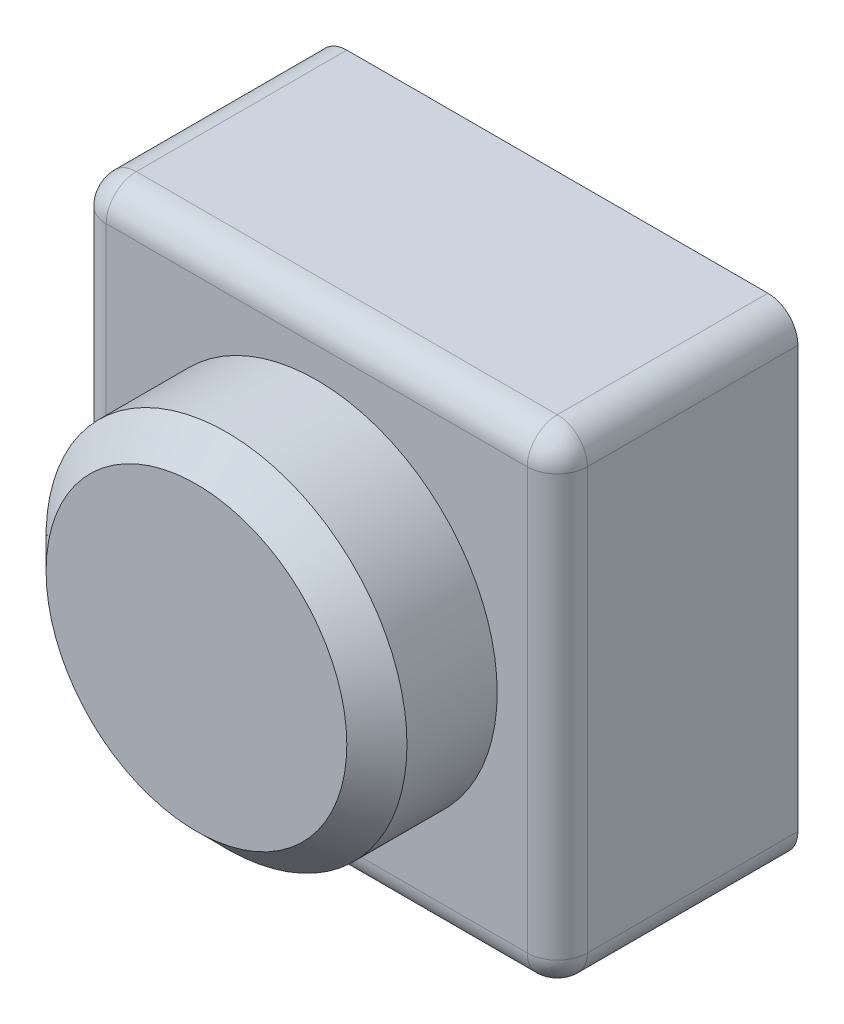
ISO-10303-21;
HEADER;
FILE_DESCRIPTION(('STEP AP214'),'2;1');
FILE_NAME('part.step','',(''),(''),'','','');
FILE_SCHEMA(('AUTOMOTIVE_DESIGN { 1 0 10303 214 1 1 1 1 }'));
ENDSEC;
DATA;
#1=APPLICATION_CONTEXT('core data for automotive mechanical design processes');
#2=APPLICATION_PROTOCOL_DEFINITION('international standard','automotive_design',2000,#1);
#3=PRODUCT_CONTEXT('',#1,'mechanical');
#4=PRODUCT('Part','Part','',(#3));
#5=PRODUCT_RELATED_PRODUCT_CATEGORY('part','',(#4));
#6=PRODUCT_DEFINITION_FORMATION('','',#4);
#7=PRODUCT_DEFINITION_CONTEXT('part definition',#1,'design');
#8=PRODUCT_DEFINITION('design','',#6,#7);
#9=PRODUCT_DEFINITION_SHAPE('','',#8);
#10=(LENGTH_UNIT() NAMED_UNIT(*) SI_UNIT(.MILLI.,.METRE.));
#11=(NAMED_UNIT(*) PLANE_ANGLE_UNIT() SI_UNIT($,.RADIAN.));
#12=(NAMED_UNIT(*) SI_UNIT($,.STERADIAN.) SOLID_ANGLE_UNIT());
#13=UNCERTAINTY_MEASURE_WITH_UNIT(LENGTH_MEASURE(1.E-05),#10,'distance_accuracy_value','');
#14=(GEOMETRIC_REPRESENTATION_CONTEXT(3) GLOBAL_UNCERTAINTY_ASSIGNED_CONTEXT((#13)) GLOBAL_UNIT_ASSIGNED_CONTEXT((#10,
#11,#12)) REPRESENTATION_CONTEXT('',''));
#15=CARTESIAN_POINT('',(0.,0.,0.));
#16=DIRECTION('',(0.,0.,1.));
#17=DIRECTION('',(1.,0.,0.));
#18=AXIS2_PLACEMENT_3D('',#15,#16,#17);
#19=CARTESIAN_POINT('',(40.,-40.,40.));
#20=DIRECTION('',(-1.,0.,0.));
#21=DIRECTION('',(0.,0.,1.));
#22=AXIS2_PLACEMENT_3D('',#19,#20,#21);
#23=PLANE('',#22);
#24=DIRECTION('',(0.,1.,0.));
#25=VECTOR('',#24,1.);
#26=CARTESIAN_POINT('',(40.,-40.,0.));
#27=LINE('',#26,#25);
#28=CARTESIAN_POINT('',(40.,-35.,0.));
#29=VERTEX_POINT('',#28);
#30=CARTESIAN_POINT('',(40.,35.,0.));
#31=VERTEX_POINT('',#30);
#32=EDGE_CURVE('E184',#29,#31,#27,.T.);
#33=ORIENTED_EDGE('',*,*,#32,.T.);
#34=DIRECTION('',(0.,0.,-1.));
#35=VECTOR('',#34,1.);
#36=CARTESIAN_POINT('',(40.,35.,40.));
#37=LINE('',#36,#35);
#38=CARTESIAN_POINT('',(40.,35.,35.));
#39=VERTEX_POINT('',#38);
#40=EDGE_CURVE('E227',#31,#39,#37,.F.);
#41=ORIENTED_EDGE('',*,*,#40,.T.);
#42=DIRECTION('',(0.,1.,0.));
#43=VECTOR('',#42,1.);
#44=CARTESIAN_POINT('',(40.,-40.,35.));
#45=LINE('',#44,#43);
#46=CARTESIAN_POINT('',(40.,-35.,35.));
#47=VERTEX_POINT('',#46);
#48=EDGE_CURVE('E223',#39,#47,#45,.F.);
#49=ORIENTED_EDGE('',*,*,#48,.T.);
#50=DIRECTION('',(0.,0.,-1.));
#51=VECTOR('',#50,1.);
#52=CARTESIAN_POINT('',(40.,-35.,40.));
#53=LINE('',#52,#51);
#54=EDGE_CURVE('E225',#47,#29,#53,.T.);
#55=ORIENTED_EDGE('',*,*,#54,.T.);
#56=EDGE_LOOP('',(#33,#41,#49,#55));
#57=FACE_BOUND('',#56,.T.);
#58=ADVANCED_FACE('F40',(#57),#23,.F.);
#59=CARTESIAN_POINT('',(-40.,40.,40.));
#60=DIRECTION('',(0.,-1.,0.));
#61=DIRECTION('',(0.,0.,-1.));
#62=AXIS2_PLACEMENT_3D('',#59,#60,#61);
#63=PLANE('',#62);
#64=DIRECTION('',(-1.,0.,0.));
#65=VECTOR('',#64,1.);
#66=CARTESIAN_POINT('',(-40.,40.,35.));
#67=LINE('',#66,#65);
#68=CARTESIAN_POINT('',(-35.,40.,35.));
#69=VERTEX_POINT('',#68);
#70=CARTESIAN_POINT('',(35.,40.,35.));
#71=VERTEX_POINT('',#70);
#72=EDGE_CURVE('E208',#69,#71,#67,.F.);
#73=ORIENTED_EDGE('',*,*,#72,.T.);
#74=DIRECTION('',(0.,0.,-1.));
#75=VECTOR('',#74,1.);
#76=CARTESIAN_POINT('',(35.,40.,40.));
#77=LINE('',#76,#75);
#78=CARTESIAN_POINT('',(35.,40.,0.));
#79=VERTEX_POINT('',#78);
#80=EDGE_CURVE('E212',#71,#79,#77,.T.);
#81=ORIENTED_EDGE('',*,*,#80,.T.);
#82=DIRECTION('',(-1.,0.,0.));
#83=VECTOR('',#82,1.);
#84=CARTESIAN_POINT('',(-40.,40.,0.));
#85=LINE('',#84,#83);
#86=CARTESIAN_POINT('',(-35.,40.,0.));
#87=VERTEX_POINT('',#86);
#88=EDGE_CURVE('E195',#79,#87,#85,.T.);
#89=ORIENTED_EDGE('',*,*,#88,.T.);
#90=DIRECTION('',(0.,0.,-1.));
#91=VECTOR('',#90,1.);
#92=CARTESIAN_POINT('',(-35.,40.,40.));
#93=LINE('',#92,#91);
#94=EDGE_CURVE('E210',#87,#69,#93,.F.);
#95=ORIENTED_EDGE('',*,*,#94,.T.);
#96=EDGE_LOOP('',(#73,#81,#89,#95));
#97=FACE_BOUND('',#96,.T.);
#98=ADVANCED_FACE('F301',(#97),#63,.F.);
#99=CARTESIAN_POINT('',(-40.,-40.,40.));
#100=DIRECTION('',(1.,0.,0.));
#101=DIRECTION('',(0.,0.,-1.));
#102=AXIS2_PLACEMENT_3D('',#99,#100,#101);
#103=PLANE('',#102);
#104=DIRECTION('',(0.,-1.,0.));
#105=VECTOR('',#104,1.);
#106=CARTESIAN_POINT('',(-40.,-40.,0.));
#107=LINE('',#106,#105);
#108=CARTESIAN_POINT('',(-40.,35.,0.));
#109=VERTEX_POINT('',#108);
#110=CARTESIAN_POINT('',(-40.,-35.,0.));
#111=VERTEX_POINT('',#110);
#112=EDGE_CURVE('E198',#109,#111,#107,.T.);
#113=ORIENTED_EDGE('',*,*,#112,.T.);
#114=DIRECTION('',(0.,0.,-1.));
#115=VECTOR('',#114,1.);
#116=CARTESIAN_POINT('',(-40.,-35.,40.));
#117=LINE('',#116,#115);
#118=CARTESIAN_POINT('',(-40.,-35.,35.));
#119=VERTEX_POINT('',#118);
#120=EDGE_CURVE('E239',#111,#119,#117,.F.);
#121=ORIENTED_EDGE('',*,*,#120,.T.);
#122=DIRECTION('',(0.,-1.,0.));
#123=VECTOR('',#122,1.);
#124=CARTESIAN_POINT('',(-40.,-40.,35.));
#125=LINE('',#124,#123);
#126=CARTESIAN_POINT('',(-40.,35.,35.));
#127=VERTEX_POINT('',#126);
#128=EDGE_CURVE('E235',#119,#127,#125,.F.);
#129=ORIENTED_EDGE('',*,*,#128,.T.);
#130=DIRECTION('',(0.,0.,-1.));
#131=VECTOR('',#130,1.);
#132=CARTESIAN_POINT('',(-40.,35.,40.));
#133=LINE('',#132,#131);
#134=EDGE_CURVE('E237',#127,#109,#133,.T.);
#135=ORIENTED_EDGE('',*,*,#134,.T.);
#136=EDGE_LOOP('',(#113,#121,#129,#135));
#137=FACE_BOUND('',#136,.T.);
#138=ADVANCED_FACE('F307',(#137),#103,.F.);
#139=CARTESIAN_POINT('',(-40.,-40.,40.));
#140=DIRECTION('',(0.,1.,0.));
#141=DIRECTION('',(0.,0.,1.));
#142=AXIS2_PLACEMENT_3D('',#139,#140,#141);
#143=PLANE('',#142);
#144=DIRECTION('',(1.,0.,0.));
#145=VECTOR('',#144,1.);
#146=CARTESIAN_POINT('',(-40.,-40.,0.));
#147=LINE('',#146,#145);
#148=CARTESIAN_POINT('',(-35.,-40.,0.));
#149=VERTEX_POINT('',#148);
#150=CARTESIAN_POINT('',(35.,-40.,0.));
#151=VERTEX_POINT('',#150);
#152=EDGE_CURVE('E192',#149,#151,#147,.T.);
#153=ORIENTED_EDGE('',*,*,#152,.T.);
#154=DIRECTION('',(0.,0.,-1.));
#155=VECTOR('',#154,1.);
#156=CARTESIAN_POINT('',(35.,-40.,40.));
#157=LINE('',#156,#155);
#158=CARTESIAN_POINT('',(35.,-40.,35.));
#159=VERTEX_POINT('',#158);
#160=EDGE_CURVE('E233',#151,#159,#157,.F.);
#161=ORIENTED_EDGE('',*,*,#160,.T.);
#162=DIRECTION('',(1.,0.,0.));
#163=VECTOR('',#162,1.);
#164=CARTESIAN_POINT('',(-40.,-40.,35.));
#165=LINE('',#164,#163);
#166=CARTESIAN_POINT('',(-35.,-40.,35.));
#167=VERTEX_POINT('',#166);
#168=EDGE_CURVE('E229',#159,#167,#165,.F.);
#169=ORIENTED_EDGE('',*,*,#168,.T.);
#170=DIRECTION('',(0.,0.,-1.));
#171=VECTOR('',#170,1.);
#172=CARTESIAN_POINT('',(-35.,-40.,40.));
#173=LINE('',#172,#171);
#174=EDGE_CURVE('E231',#167,#149,#173,.T.);
#175=ORIENTED_EDGE('',*,*,#174,.T.);
#176=EDGE_LOOP('',(#153,#161,#169,#175));
#177=FACE_BOUND('',#176,.T.);
#178=ADVANCED_FACE('F393',(#177),#143,.F.);
#179=CARTESIAN_POINT('',(0.,0.,40.));
#180=DIRECTION('',(0.,0.,-1.));
#181=DIRECTION('',(-1.,0.,0.));
#182=AXIS2_PLACEMENT_3D('',#179,#180,#181);
#183=PLANE('',#182);
#184=DIRECTION('',(1.,0.,0.));
#185=VECTOR('',#184,1.);
#186=CARTESIAN_POINT('',(0.,-35.,40.));
#187=LINE('',#186,#185);
#188=CARTESIAN_POINT('',(-35.,-35.,40.));
#189=VERTEX_POINT('',#188);
#190=CARTESIAN_POINT('',(35.,-35.,40.));
#191=VERTEX_POINT('',#190);
#192=EDGE_CURVE('E49',#189,#191,#187,.T.);
#193=ORIENTED_EDGE('',*,*,#192,.T.);
#194=DIRECTION('',(0.,1.,0.));
#195=VECTOR('',#194,1.);
#196=CARTESIAN_POINT('',(35.,0.,40.));
#197=LINE('',#196,#195);
#198=CARTESIAN_POINT('',(35.,35.,40.));
#199=VERTEX_POINT('',#198);
#200=EDGE_CURVE('E11',#191,#199,#197,.T.);
#201=ORIENTED_EDGE('',*,*,#200,.T.);
#202=DIRECTION('',(-1.,0.,0.));
#203=VECTOR('',#202,1.);
#204=CARTESIAN_POINT('',(0.,35.,40.));
#205=LINE('',#204,#203);
#206=CARTESIAN_POINT('',(-35.,35.,40.));
#207=VERTEX_POINT('',#206);
#208=EDGE_CURVE('E241',#199,#207,#205,.T.);
#209=ORIENTED_EDGE('',*,*,#208,.T.);
#210=DIRECTION('',(0.,-1.,0.));
#211=VECTOR('',#210,1.);
#212=CARTESIAN_POINT('',(-35.,0.,40.));
#213=LINE('',#212,#211);
#214=EDGE_CURVE('E60',#207,#189,#213,.T.);
#215=ORIENTED_EDGE('',*,*,#214,.T.);
#216=EDGE_LOOP('',(#193,#201,#209,#215));
#217=FACE_BOUND('',#216,.T.);
#218=CARTESIAN_POINT('',(0.,0.,40.));
#219=DIRECTION('',(0.,0.,1.));
#220=DIRECTION('',(1.,0.,0.));
#221=AXIS2_PLACEMENT_3D('',#218,#219,#220);
#222=CIRCLE('',#221,30.);
#223=CARTESIAN_POINT('',(30.,0.,40.));
#224=VERTEX_POINT('',#223);
#225=EDGE_CURVE('E188',#224,#224,#222,.T.);
#226=ORIENTED_EDGE('',*,*,#225,.F.);
#227=EDGE_LOOP('',(#226));
#228=FACE_BOUND('',#227,.T.);
#229=ADVANCED_FACE('F390',(#217,#228),#183,.F.);
#230=CARTESIAN_POINT('',(0.,0.,0.));
#231=DIRECTION('',(0.,0.,-1.));
#232=DIRECTION('',(-1.,0.,0.));
#233=AXIS2_PLACEMENT_3D('',#230,#231,#232);
#234=PLANE('',#233);
#235=DIRECTION('',(0.,1.,0.));
#236=VECTOR('',#235,1.);
#237=CARTESIAN_POINT('',(-30.,-30.,0.));
#238=LINE('',#237,#236);
#239=CARTESIAN_POINT('',(-30.,-30.,0.));
#240=VERTEX_POINT('',#239);
#241=CARTESIAN_POINT('',(-30.,30.,0.));
#242=VERTEX_POINT('',#241);
#243=EDGE_CURVE('E148',#240,#242,#238,.T.);
#244=ORIENTED_EDGE('',*,*,#243,.F.);
#245=DIRECTION('',(-1.,0.,0.));
#246=VECTOR('',#245,1.);
#247=CARTESIAN_POINT('',(30.,-30.,0.));
#248=LINE('',#247,#246);
#249=CARTESIAN_POINT('',(30.,-30.,0.));
#250=VERTEX_POINT('',#249);
#251=EDGE_CURVE('E165',#250,#240,#248,.T.);
#252=ORIENTED_EDGE('',*,*,#251,.F.);
#253=DIRECTION('',(0.,-1.,0.));
#254=VECTOR('',#253,1.);
#255=CARTESIAN_POINT('',(30.,-30.,0.));
#256=LINE('',#255,#254);
#257=CARTESIAN_POINT('',(30.,30.,0.));
#258=VERTEX_POINT('',#257);
#259=EDGE_CURVE('E168',#258,#250,#256,.T.);
#260=ORIENTED_EDGE('',*,*,#259,.F.);
#261=DIRECTION('',(1.,0.,0.));
#262=VECTOR('',#261,1.);
#263=CARTESIAN_POINT('',(30.,30.,0.));
#264=LINE('',#263,#262);
#265=EDGE_CURVE('E177',#242,#258,#264,.T.);
#266=ORIENTED_EDGE('',*,*,#265,.F.);
#267=EDGE_LOOP('',(#244,#252,#260,#266));
#268=FACE_BOUND('',#267,.T.);
#269=ORIENTED_EDGE('',*,*,#88,.F.);
#270=CARTESIAN_POINT('',(35.,35.,0.));
#271=DIRECTION('',(0.,0.,-1.));
#272=DIRECTION('',(-1.,0.,0.));
#273=AXIS2_PLACEMENT_3D('',#270,#271,#272);
#274=CIRCLE('',#273,5.);
#275=EDGE_CURVE('E221',#79,#31,#274,.T.);
#276=ORIENTED_EDGE('',*,*,#275,.T.);
#277=ORIENTED_EDGE('',*,*,#32,.F.);
#278=CARTESIAN_POINT('',(35.,-35.,0.));
#279=DIRECTION('',(0.,0.,-1.));
#280=DIRECTION('',(-1.,0.,0.));
#281=AXIS2_PLACEMENT_3D('',#278,#279,#280);
#282=CIRCLE('',#281,5.);
#283=EDGE_CURVE('E219',#29,#151,#282,.T.);
#284=ORIENTED_EDGE('',*,*,#283,.T.);
#285=ORIENTED_EDGE('',*,*,#152,.F.);
#286=CARTESIAN_POINT('',(-35.,-35.,0.));
#287=DIRECTION('',(0.,0.,-1.));
#288=DIRECTION('',(-1.,0.,0.));
#289=AXIS2_PLACEMENT_3D('',#286,#287,#288);
#290=CIRCLE('',#289,5.);
#291=EDGE_CURVE('E217',#149,#111,#290,.T.);
#292=ORIENTED_EDGE('',*,*,#291,.T.);
#293=ORIENTED_EDGE('',*,*,#112,.F.);
#294=CARTESIAN_POINT('',(-35.,35.,0.));
#295=DIRECTION('',(0.,0.,-1.));
#296=DIRECTION('',(-1.,0.,0.));
#297=AXIS2_PLACEMENT_3D('',#294,#295,#296);
#298=CIRCLE('',#297,5.);
#299=EDGE_CURVE('E215',#109,#87,#298,.T.);
#300=ORIENTED_EDGE('',*,*,#299,.T.);
#301=EDGE_LOOP('',(#269,#276,#277,#284,#285,#292,#293,#300));
#302=FACE_BOUND('',#301,.T.);
#303=ADVANCED_FACE('F374',(#268,#302),#234,.T.);
#304=CARTESIAN_POINT('',(0.,0.,60.));
#305=DIRECTION('',(0.,0.,-1.));
#306=DIRECTION('',(-1.,0.,0.));
#307=AXIS2_PLACEMENT_3D('',#304,#305,#306);
#308=CYLINDRICAL_SURFACE('',#307,30.);
#309=CARTESIAN_POINT('',(0.,0.,55.));
#310=DIRECTION('',(0.,0.,1.));
#311=DIRECTION('',(1.,0.,0.));
#312=AXIS2_PLACEMENT_3D('',#309,#310,#311);
#313=CIRCLE('',#312,30.);
#314=CARTESIAN_POINT('',(30.,0.,55.));
#315=VERTEX_POINT('',#314);
#316=EDGE_CURVE('E205',#315,#315,#313,.F.);
#317=ORIENTED_EDGE('',*,*,#316,.T.);
#318=EDGE_LOOP('',(#317));
#319=FACE_BOUND('',#318,.T.);
#320=ORIENTED_EDGE('',*,*,#225,.T.);
#321=EDGE_LOOP('',(#320));
#322=FACE_BOUND('',#321,.T.);
#323=ADVANCED_FACE('F397',(#319,#322),#308,.T.);
#324=CARTESIAN_POINT('',(0.,0.,60.));
#325=DIRECTION('',(0.,0.,1.));
#326=DIRECTION('',(1.,0.,0.));
#327=AXIS2_PLACEMENT_3D('',#324,#325,#326);
#328=PLANE('',#327);
#329=CARTESIAN_POINT('',(0.,0.,60.));
#330=DIRECTION('',(0.,0.,1.));
#331=DIRECTION('',(1.,0.,0.));
#332=AXIS2_PLACEMENT_3D('',#329,#330,#331);
#333=CIRCLE('',#332,25.);
#334=CARTESIAN_POINT('',(25.,0.,60.));
#335=VERTEX_POINT('',#334);
#336=EDGE_CURVE('E191',#335,#335,#333,.T.);
#337=ORIENTED_EDGE('',*,*,#336,.T.);
#338=EDGE_LOOP('',(#337));
#339=FACE_BOUND('',#338,.T.);
#340=ADVANCED_FACE('F399',(#339),#328,.T.);
#341=CARTESIAN_POINT('',(-30.,-30.,30.));
#342=DIRECTION('',(-1.,0.,0.));
#343=DIRECTION('',(0.,0.,1.));
#344=AXIS2_PLACEMENT_3D('',#341,#342,#343);
#345=PLANE('',#344);
#346=ORIENTED_EDGE('',*,*,#243,.T.);
#347=DIRECTION('',(0.,0.,-1.));
#348=VECTOR('',#347,1.);
#349=CARTESIAN_POINT('',(-30.,30.,30.));
#350=LINE('',#349,#348);
#351=CARTESIAN_POINT('',(-30.,30.,30.));
#352=VERTEX_POINT('',#351);
#353=EDGE_CURVE('E141',#352,#242,#350,.T.);
#354=ORIENTED_EDGE('',*,*,#353,.F.);
#355=DIRECTION('',(0.,1.,0.));
#356=VECTOR('',#355,1.);
#357=CARTESIAN_POINT('',(-30.,-30.,30.));
#358=LINE('',#357,#356);
#359=CARTESIAN_POINT('',(-30.,-30.,30.));
#360=VERTEX_POINT('',#359);
#361=EDGE_CURVE('E145',#360,#352,#358,.T.);
#362=ORIENTED_EDGE('',*,*,#361,.F.);
#363=DIRECTION('',(0.,0.,-1.));
#364=VECTOR('',#363,1.);
#365=CARTESIAN_POINT('',(-30.,-30.,30.));
#366=LINE('',#365,#364);
#367=EDGE_CURVE('E182',#360,#240,#366,.T.);
#368=ORIENTED_EDGE('',*,*,#367,.T.);
#369=EDGE_LOOP('',(#346,#354,#362,#368));
#370=FACE_BOUND('',#369,.T.);
#371=ADVANCED_FACE('F143',(#370),#345,.F.);
#372=CARTESIAN_POINT('',(30.,-30.,30.));
#373=DIRECTION('',(0.,-1.,0.));
#374=DIRECTION('',(0.,0.,-1.));
#375=AXIS2_PLACEMENT_3D('',#372,#373,#374);
#376=PLANE('',#375);
#377=ORIENTED_EDGE('',*,*,#251,.T.);
#378=ORIENTED_EDGE('',*,*,#367,.F.);
#379=DIRECTION('',(-1.,0.,0.));
#380=VECTOR('',#379,1.);
#381=CARTESIAN_POINT('',(30.,-30.,30.));
#382=LINE('',#381,#380);
#383=CARTESIAN_POINT('',(30.,-30.,30.));
#384=VERTEX_POINT('',#383);
#385=EDGE_CURVE('E153',#384,#360,#382,.T.);
#386=ORIENTED_EDGE('',*,*,#385,.F.);
#387=DIRECTION('',(0.,0.,-1.));
#388=VECTOR('',#387,1.);
#389=CARTESIAN_POINT('',(30.,-30.,30.));
#390=LINE('',#389,#388);
#391=EDGE_CURVE('E185',#384,#250,#390,.T.);
#392=ORIENTED_EDGE('',*,*,#391,.T.);
#393=EDGE_LOOP('',(#377,#378,#386,#392));
#394=FACE_BOUND('',#393,.T.);
#395=ADVANCED_FACE('F572',(#394),#376,.F.);
#396=CARTESIAN_POINT('',(30.,-30.,30.));
#397=DIRECTION('',(1.,0.,0.));
#398=DIRECTION('',(0.,0.,-1.));
#399=AXIS2_PLACEMENT_3D('',#396,#397,#398);
#400=PLANE('',#399);
#401=ORIENTED_EDGE('',*,*,#259,.T.);
#402=ORIENTED_EDGE('',*,*,#391,.F.);
#403=DIRECTION('',(0.,-1.,0.));
#404=VECTOR('',#403,1.);
#405=CARTESIAN_POINT('',(30.,-30.,30.));
#406=LINE('',#405,#404);
#407=CARTESIAN_POINT('',(30.,30.,30.));
#408=VERTEX_POINT('',#407);
#409=EDGE_CURVE('E161',#408,#384,#406,.T.);
#410=ORIENTED_EDGE('',*,*,#409,.F.);
#411=DIRECTION('',(0.,0.,-1.));
#412=VECTOR('',#411,1.);
#413=CARTESIAN_POINT('',(30.,30.,30.));
#414=LINE('',#413,#412);
#415=EDGE_CURVE('E152',#408,#258,#414,.T.);
#416=ORIENTED_EDGE('',*,*,#415,.T.);
#417=EDGE_LOOP('',(#401,#402,#410,#416));
#418=FACE_BOUND('',#417,.T.);
#419=ADVANCED_FACE('F563',(#418),#400,.F.);
#420=CARTESIAN_POINT('',(30.,30.,30.));
#421=DIRECTION('',(0.,1.,0.));
#422=DIRECTION('',(0.,0.,1.));
#423=AXIS2_PLACEMENT_3D('',#420,#421,#422);
#424=PLANE('',#423);
#425=ORIENTED_EDGE('',*,*,#265,.T.);
#426=ORIENTED_EDGE('',*,*,#415,.F.);
#427=DIRECTION('',(1.,0.,0.));
#428=VECTOR('',#427,1.);
#429=CARTESIAN_POINT('',(30.,30.,30.));
#430=LINE('',#429,#428);
#431=EDGE_CURVE('E156',#352,#408,#430,.T.);
#432=ORIENTED_EDGE('',*,*,#431,.F.);
#433=ORIENTED_EDGE('',*,*,#353,.T.);
#434=EDGE_LOOP('',(#425,#426,#432,#433));
#435=FACE_BOUND('',#434,.T.);
#436=ADVANCED_FACE('F157',(#435),#424,.F.);
#437=CARTESIAN_POINT('',(0.,0.,30.));
#438=DIRECTION('',(0.,0.,1.));
#439=DIRECTION('',(1.,0.,0.));
#440=AXIS2_PLACEMENT_3D('',#437,#438,#439);
#441=PLANE('',#440);
#442=CARTESIAN_POINT('',(0.,0.,30.));
#443=DIRECTION('',(0.,0.,-1.));
#444=DIRECTION('',(-1.,0.,0.));
#445=AXIS2_PLACEMENT_3D('',#442,#443,#444);
#446=CIRCLE('',#445,20.);
#447=CARTESIAN_POINT('',(-20.,0.,30.));
#448=VERTEX_POINT('',#447);
#449=EDGE_CURVE('E171',#448,#448,#446,.T.);
#450=ORIENTED_EDGE('',*,*,#449,.F.);
#451=EDGE_LOOP('',(#450));
#452=FACE_BOUND('',#451,.T.);
#453=ORIENTED_EDGE('',*,*,#361,.T.);
#454=ORIENTED_EDGE('',*,*,#431,.T.);
#455=ORIENTED_EDGE('',*,*,#409,.T.);
#456=ORIENTED_EDGE('',*,*,#385,.T.);
#457=EDGE_LOOP('',(#453,#454,#455,#456));
#458=FACE_BOUND('',#457,.T.);
#459=ADVANCED_FACE('F163',(#452,#458),#441,.F.);
#460=CARTESIAN_POINT('',(0.,0.,50.));
#461=DIRECTION('',(0.,0.,-1.));
#462=DIRECTION('',(-1.,0.,0.));
#463=AXIS2_PLACEMENT_3D('',#460,#461,#462);
#464=CYLINDRICAL_SURFACE('',#463,20.);
#465=CARTESIAN_POINT('',(0.,0.,50.));
#466=DIRECTION('',(0.,0.,-1.));
#467=DIRECTION('',(-1.,0.,0.));
#468=AXIS2_PLACEMENT_3D('',#465,#466,#467);
#469=CIRCLE('',#468,20.);
#470=CARTESIAN_POINT('',(-20.,0.,50.));
#471=VERTEX_POINT('',#470);
#472=EDGE_CURVE('E178',#471,#471,#469,.T.);
#473=ORIENTED_EDGE('',*,*,#472,.F.);
#474=EDGE_LOOP('',(#473));
#475=FACE_BOUND('',#474,.T.);
#476=ORIENTED_EDGE('',*,*,#449,.T.);
#477=EDGE_LOOP('',(#476));
#478=FACE_BOUND('',#477,.T.);
#479=ADVANCED_FACE('F289',(#475,#478),#464,.F.);
#480=CARTESIAN_POINT('',(0.,0.,50.));
#481=DIRECTION('',(0.,0.,-1.));
#482=DIRECTION('',(-1.,0.,0.));
#483=AXIS2_PLACEMENT_3D('',#480,#481,#482);
#484=PLANE('',#483);
#485=ORIENTED_EDGE('',*,*,#472,.T.);
#486=EDGE_LOOP('',(#485));
#487=FACE_BOUND('',#486,.T.);
#488=ADVANCED_FACE('F287',(#487),#484,.T.);
#489=CARTESIAN_POINT('',(0.,0.,60.));
#490=DIRECTION('',(0.,0.,-1.));
#491=DIRECTION('',(-1.,0.,0.));
#492=AXIS2_PLACEMENT_3D('',#489,#490,#491);
#493=CONICAL_SURFACE('',#492,25.,0.785398163397447);
#494=ORIENTED_EDGE('',*,*,#316,.F.);
#495=EDGE_LOOP('',(#494));
#496=FACE_BOUND('',#495,.T.);
#497=ORIENTED_EDGE('',*,*,#336,.F.);
#498=EDGE_LOOP('',(#497));
#499=FACE_BOUND('',#498,.T.);
#500=ADVANCED_FACE('F296',(#496,#499),#493,.T.);
#501=CARTESIAN_POINT('',(-35.,-35.,40.));
#502=DIRECTION('',(0.,0.,-1.));
#503=DIRECTION('',(-1.,0.,0.));
#504=AXIS2_PLACEMENT_3D('',#501,#502,#503);
#505=CYLINDRICAL_SURFACE('',#504,5.);
#506=CARTESIAN_POINT('',(-35.,-35.,35.));
#507=DIRECTION('',(0.,0.,1.));
#508=DIRECTION('',(1.,0.,0.));
#509=AXIS2_PLACEMENT_3D('',#506,#507,#508);
#510=CIRCLE('',#509,5.);
#511=EDGE_CURVE('E44',#119,#167,#510,.T.);
#512=ORIENTED_EDGE('',*,*,#511,.F.);
#513=ORIENTED_EDGE('',*,*,#120,.F.);
#514=ORIENTED_EDGE('',*,*,#291,.F.);
#515=ORIENTED_EDGE('',*,*,#174,.F.);
#516=EDGE_LOOP('',(#512,#513,#514,#515));
#517=FACE_BOUND('',#516,.T.);
#518=ADVANCED_FACE('F42',(#517),#505,.T.);
#519=CARTESIAN_POINT('',(-35.,-35.,35.));
#520=DIRECTION('',(0.,-1.,0.));
#521=DIRECTION('',(0.,0.,-1.));
#522=AXIS2_PLACEMENT_3D('',#519,#520,#521);
#523=SPHERICAL_SURFACE('',#522,5.);
#524=CARTESIAN_POINT('',(-35.,-35.,35.));
#525=DIRECTION('',(0.,-1.,0.));
#526=DIRECTION('',(0.,0.,-1.));
#527=AXIS2_PLACEMENT_3D('',#524,#525,#526);
#528=CIRCLE('',#527,5.);
#529=EDGE_CURVE('E271',#119,#189,#528,.F.);
#530=ORIENTED_EDGE('',*,*,#529,.F.);
#531=ORIENTED_EDGE('',*,*,#511,.T.);
#532=CARTESIAN_POINT('',(-35.,-35.,35.));
#533=DIRECTION('',(-1.,0.,0.));
#534=DIRECTION('',(0.,0.,1.));
#535=AXIS2_PLACEMENT_3D('',#532,#533,#534);
#536=CIRCLE('',#535,5.);
#537=EDGE_CURVE('E272',#189,#167,#536,.F.);
#538=ORIENTED_EDGE('',*,*,#537,.F.);
#539=EDGE_LOOP('',(#530,#531,#538));
#540=FACE_BOUND('',#539,.T.);
#541=ADVANCED_FACE('F355',(#540),#523,.T.);
#542=CARTESIAN_POINT('',(35.,-35.,40.));
#543=DIRECTION('',(0.,0.,-1.));
#544=DIRECTION('',(-1.,0.,0.));
#545=AXIS2_PLACEMENT_3D('',#542,#543,#544);
#546=CYLINDRICAL_SURFACE('',#545,5.);
#547=ORIENTED_EDGE('',*,*,#283,.F.);
#548=ORIENTED_EDGE('',*,*,#54,.F.);
#549=CARTESIAN_POINT('',(35.,-35.,35.));
#550=DIRECTION('',(0.,0.,1.));
#551=DIRECTION('',(1.,0.,0.));
#552=AXIS2_PLACEMENT_3D('',#549,#550,#551);
#553=CIRCLE('',#552,5.);
#554=EDGE_CURVE('E268',#159,#47,#553,.T.);
#555=ORIENTED_EDGE('',*,*,#554,.F.);
#556=ORIENTED_EDGE('',*,*,#160,.F.);
#557=EDGE_LOOP('',(#547,#548,#555,#556));
#558=FACE_BOUND('',#557,.T.);
#559=ADVANCED_FACE('F353',(#558),#546,.T.);
#560=CARTESIAN_POINT('',(0.,-35.,35.));
#561=DIRECTION('',(1.,0.,0.));
#562=DIRECTION('',(0.,0.,-1.));
#563=AXIS2_PLACEMENT_3D('',#560,#561,#562);
#564=CYLINDRICAL_SURFACE('',#563,5.);
#565=ORIENTED_EDGE('',*,*,#537,.T.);
#566=ORIENTED_EDGE('',*,*,#168,.F.);
#567=CARTESIAN_POINT('',(35.,-35.,35.));
#568=DIRECTION('',(1.,0.,0.));
#569=DIRECTION('',(0.,0.,-1.));
#570=AXIS2_PLACEMENT_3D('',#567,#568,#569);
#571=CIRCLE('',#570,5.);
#572=EDGE_CURVE('E265',#191,#159,#571,.T.);
#573=ORIENTED_EDGE('',*,*,#572,.F.);
#574=ORIENTED_EDGE('',*,*,#192,.F.);
#575=EDGE_LOOP('',(#565,#566,#573,#574));
#576=FACE_BOUND('',#575,.T.);
#577=ADVANCED_FACE('F349',(#576),#564,.T.);
#578=CARTESIAN_POINT('',(-35.,0.,35.));
#579=DIRECTION('',(0.,-1.,0.));
#580=DIRECTION('',(0.,0.,-1.));
#581=AXIS2_PLACEMENT_3D('',#578,#579,#580);
#582=CYLINDRICAL_SURFACE('',#581,5.);
#583=ORIENTED_EDGE('',*,*,#529,.T.);
#584=ORIENTED_EDGE('',*,*,#214,.F.);
#585=CARTESIAN_POINT('',(-35.,35.,35.));
#586=DIRECTION('',(0.,1.,0.));
#587=DIRECTION('',(0.,0.,1.));
#588=AXIS2_PLACEMENT_3D('',#585,#586,#587);
#589=CIRCLE('',#588,5.);
#590=EDGE_CURVE('E262',#127,#207,#589,.T.);
#591=ORIENTED_EDGE('',*,*,#590,.F.);
#592=ORIENTED_EDGE('',*,*,#128,.F.);
#593=EDGE_LOOP('',(#583,#584,#591,#592));
#594=FACE_BOUND('',#593,.T.);
#595=ADVANCED_FACE('F345',(#594),#582,.T.);
#596=CARTESIAN_POINT('',(-35.,35.,40.));
#597=DIRECTION('',(0.,0.,-1.));
#598=DIRECTION('',(-1.,0.,0.));
#599=AXIS2_PLACEMENT_3D('',#596,#597,#598);
#600=CYLINDRICAL_SURFACE('',#599,5.);
#601=ORIENTED_EDGE('',*,*,#299,.F.);
#602=ORIENTED_EDGE('',*,*,#134,.F.);
#603=CARTESIAN_POINT('',(-35.,35.,35.));
#604=DIRECTION('',(0.,0.,1.));
#605=DIRECTION('',(1.,0.,0.));
#606=AXIS2_PLACEMENT_3D('',#603,#604,#605);
#607=CIRCLE('',#606,5.);
#608=EDGE_CURVE('E259',#69,#127,#607,.T.);
#609=ORIENTED_EDGE('',*,*,#608,.F.);
#610=ORIENTED_EDGE('',*,*,#94,.F.);
#611=EDGE_LOOP('',(#601,#602,#609,#610));
#612=FACE_BOUND('',#611,.T.);
#613=ADVANCED_FACE('F341',(#612),#600,.T.);
#614=CARTESIAN_POINT('',(35.,-35.,35.));
#615=DIRECTION('',(0.,-1.,0.));
#616=DIRECTION('',(0.,0.,-1.));
#617=AXIS2_PLACEMENT_3D('',#614,#615,#616);
#618=SPHERICAL_SURFACE('',#617,5.);
#619=ORIENTED_EDGE('',*,*,#572,.T.);
#620=ORIENTED_EDGE('',*,*,#554,.T.);
#621=CARTESIAN_POINT('',(35.,-35.,35.));
#622=DIRECTION('',(0.,-1.,0.));
#623=DIRECTION('',(0.,0.,-1.));
#624=AXIS2_PLACEMENT_3D('',#621,#622,#623);
#625=CIRCLE('',#624,5.);
#626=EDGE_CURVE('E256',#191,#47,#625,.F.);
#627=ORIENTED_EDGE('',*,*,#626,.F.);
#628=EDGE_LOOP('',(#619,#620,#627));
#629=FACE_BOUND('',#628,.T.);
#630=ADVANCED_FACE('F337',(#629),#618,.T.);
#631=CARTESIAN_POINT('',(-35.,35.,35.));
#632=DIRECTION('',(-1.,0.,0.));
#633=DIRECTION('',(0.,0.,1.));
#634=AXIS2_PLACEMENT_3D('',#631,#632,#633);
#635=SPHERICAL_SURFACE('',#634,5.);
#636=ORIENTED_EDGE('',*,*,#608,.T.);
#637=ORIENTED_EDGE('',*,*,#590,.T.);
#638=CARTESIAN_POINT('',(-35.,35.,35.));
#639=DIRECTION('',(-1.,0.,0.));
#640=DIRECTION('',(0.,0.,1.));
#641=AXIS2_PLACEMENT_3D('',#638,#639,#640);
#642=CIRCLE('',#641,5.);
#643=EDGE_CURVE('E253',#69,#207,#642,.F.);
#644=ORIENTED_EDGE('',*,*,#643,.F.);
#645=EDGE_LOOP('',(#636,#637,#644));
#646=FACE_BOUND('',#645,.T.);
#647=ADVANCED_FACE('F333',(#646),#635,.T.);
#648=CARTESIAN_POINT('',(35.,0.,35.));
#649=DIRECTION('',(0.,1.,0.));
#650=DIRECTION('',(0.,0.,1.));
#651=AXIS2_PLACEMENT_3D('',#648,#649,#650);
#652=CYLINDRICAL_SURFACE('',#651,5.);
#653=ORIENTED_EDGE('',*,*,#626,.T.);
#654=ORIENTED_EDGE('',*,*,#48,.F.);
#655=CARTESIAN_POINT('',(35.,35.,35.));
#656=DIRECTION('',(0.,1.,0.));
#657=DIRECTION('',(0.,0.,1.));
#658=AXIS2_PLACEMENT_3D('',#655,#656,#657);
#659=CIRCLE('',#658,5.);
#660=EDGE_CURVE('E250',#199,#39,#659,.T.);
#661=ORIENTED_EDGE('',*,*,#660,.F.);
#662=ORIENTED_EDGE('',*,*,#200,.F.);
#663=EDGE_LOOP('',(#653,#654,#661,#662));
#664=FACE_BOUND('',#663,.T.);
#665=ADVANCED_FACE('F329',(#664),#652,.T.);
#666=CARTESIAN_POINT('',(0.,35.,35.));
#667=DIRECTION('',(-1.,0.,0.));
#668=DIRECTION('',(0.,0.,1.));
#669=AXIS2_PLACEMENT_3D('',#666,#667,#668);
#670=CYLINDRICAL_SURFACE('',#669,5.);
#671=ORIENTED_EDGE('',*,*,#643,.T.);
#672=ORIENTED_EDGE('',*,*,#208,.F.);
#673=CARTESIAN_POINT('',(35.,35.,35.));
#674=DIRECTION('',(1.,0.,0.));
#675=DIRECTION('',(0.,0.,-1.));
#676=AXIS2_PLACEMENT_3D('',#673,#674,#675);
#677=CIRCLE('',#676,5.);
#678=EDGE_CURVE('E248',#71,#199,#677,.T.);
#679=ORIENTED_EDGE('',*,*,#678,.F.);
#680=ORIENTED_EDGE('',*,*,#72,.F.);
#681=EDGE_LOOP('',(#671,#672,#679,#680));
#682=FACE_BOUND('',#681,.T.);
#683=ADVANCED_FACE('F325',(#682),#670,.T.);
#684=CARTESIAN_POINT('',(35.,35.,35.));
#685=DIRECTION('',(0.,0.,1.));
#686=DIRECTION('',(1.,0.,0.));
#687=AXIS2_PLACEMENT_3D('',#684,#685,#686);
#688=SPHERICAL_SURFACE('',#687,5.);
#689=ORIENTED_EDGE('',*,*,#678,.T.);
#690=ORIENTED_EDGE('',*,*,#660,.T.);
#691=CARTESIAN_POINT('',(35.,35.,35.));
#692=DIRECTION('',(0.,0.,1.));
#693=DIRECTION('',(1.,0.,0.));
#694=AXIS2_PLACEMENT_3D('',#691,#692,#693);
#695=CIRCLE('',#694,5.);
#696=EDGE_CURVE('E245',#71,#39,#695,.F.);
#697=ORIENTED_EDGE('',*,*,#696,.F.);
#698=EDGE_LOOP('',(#689,#690,#697));
#699=FACE_BOUND('',#698,.T.);
#700=ADVANCED_FACE('F321',(#699),#688,.T.);
#701=CARTESIAN_POINT('',(35.,35.,40.));
#702=DIRECTION('',(0.,0.,-1.));
#703=DIRECTION('',(-1.,0.,0.));
#704=AXIS2_PLACEMENT_3D('',#701,#702,#703);
#705=CYLINDRICAL_SURFACE('',#704,5.);
#706=ORIENTED_EDGE('',*,*,#696,.T.);
#707=ORIENTED_EDGE('',*,*,#40,.F.);
#708=ORIENTED_EDGE('',*,*,#275,.F.);
#709=ORIENTED_EDGE('',*,*,#80,.F.);
#710=EDGE_LOOP('',(#706,#707,#708,#709));
#711=FACE_BOUND('',#710,.T.);
#712=ADVANCED_FACE('F318',(#711),#705,.T.);
#713=CLOSED_SHELL('',(#58,#98,#138,#178,#229,#303,#323,#340,#371,#395,#419,#436,#459,#479,#488,
#500,#518,#541,#559,#577,#595,#613,#630,#647,#665,#683,#700,#712));
#714=MANIFOLD_SOLID_BREP('B2',#713);
#715=ADVANCED_BREP_SHAPE_REPRESENTATION('',(#18,#714),#14);
#716=SHAPE_DEFINITION_REPRESENTATION(#9,#715);
ENDSEC;
END-ISO-10303-21;
